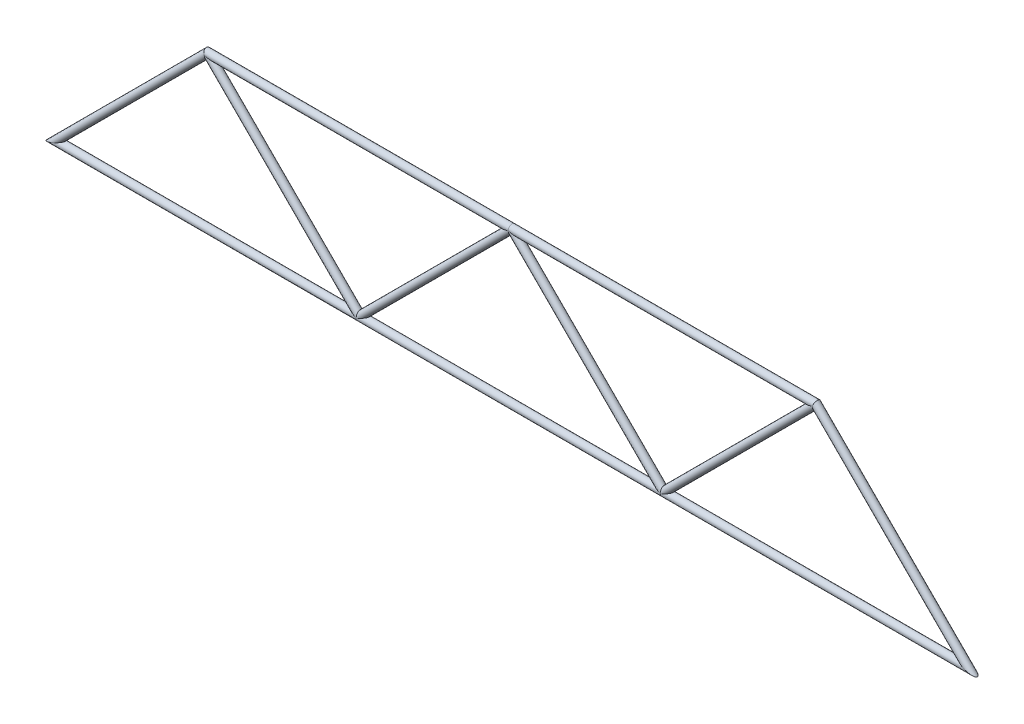
ISO-10303-21;
HEADER;
FILE_DESCRIPTION(('STEP AP214'),'2;1');
FILE_NAME('part.step','',(''),(''),'','','');
FILE_SCHEMA(('AUTOMOTIVE_DESIGN { 1 0 10303 214 1 1 1 1 }'));
ENDSEC;
DATA;
#1=APPLICATION_CONTEXT('core data for automotive mechanical design processes');
#2=APPLICATION_PROTOCOL_DEFINITION('international standard','automotive_design',2000,#1);
#3=PRODUCT_CONTEXT('',#1,'mechanical');
#4=PRODUCT('Part','Part','',(#3));
#5=PRODUCT_RELATED_PRODUCT_CATEGORY('part','',(#4));
#6=PRODUCT_DEFINITION_FORMATION('','',#4);
#7=PRODUCT_DEFINITION_CONTEXT('part definition',#1,'design');
#8=PRODUCT_DEFINITION('design','',#6,#7);
#9=PRODUCT_DEFINITION_SHAPE('','',#8);
#10=(LENGTH_UNIT() NAMED_UNIT(*) SI_UNIT(.MILLI.,.METRE.));
#11=(NAMED_UNIT(*) PLANE_ANGLE_UNIT() SI_UNIT($,.RADIAN.));
#12=(NAMED_UNIT(*) SI_UNIT($,.STERADIAN.) SOLID_ANGLE_UNIT());
#13=UNCERTAINTY_MEASURE_WITH_UNIT(LENGTH_MEASURE(1.E-05),#10,'distance_accuracy_value','');
#14=(GEOMETRIC_REPRESENTATION_CONTEXT(3) GLOBAL_UNCERTAINTY_ASSIGNED_CONTEXT((#13)) GLOBAL_UNIT_ASSIGNED_CONTEXT((#10,
#11,#12)) REPRESENTATION_CONTEXT('',''));
#15=CARTESIAN_POINT('',(0.,0.,0.));
#16=DIRECTION('',(0.,0.,1.));
#17=DIRECTION('',(1.,0.,0.));
#18=AXIS2_PLACEMENT_3D('',#15,#16,#17);
#19=CARTESIAN_POINT('',(2000.00000000001,1.11022302462516E-13,0.));
#20=DIRECTION('',(1.,0.,0.));
#21=DIRECTION('',(0.,1.,0.));
#22=AXIS2_PLACEMENT_3D('',#19,#20,#21);
#23=PLANE('',#22);
#24=CARTESIAN_POINT('',(2000.00000000001,-2.22044604925031E-13,-1.80434040253631E-13));
#25=DIRECTION('',(1.,0.,0.));
#26=DIRECTION('',(0.,1.,0.));
#27=AXIS2_PLACEMENT_3D('',#24,#25,#26);
#28=ELLIPSE('',#27,35.3553390593272,25.);
#29=CARTESIAN_POINT('',(2000.00000000001,9.99200722162641E-13,-25.0000000000002));
#30=VERTEX_POINT('',#29);
#31=CARTESIAN_POINT('',(2000.00000000001,9.43689570931383E-13,24.9999999999998));
#32=VERTEX_POINT('',#31);
#33=EDGE_CURVE('E93',#30,#32,#28,.T.);
#34=ORIENTED_EDGE('',*,*,#33,.T.);
#35=CARTESIAN_POINT('',(2000.00000000001,3.33066907387547E-13,-2.31141561761891E-13));
#36=DIRECTION('',(1.,0.,0.));
#37=DIRECTION('',(0.,1.,0.));
#38=AXIS2_PLACEMENT_3D('',#35,#36,#37);
#39=CIRCLE('',#38,25.);
#40=EDGE_CURVE('E81',#32,#30,#39,.F.);
#41=ORIENTED_EDGE('',*,*,#40,.T.);
#42=EDGE_LOOP('',(#34,#41));
#43=FACE_BOUND('',#42,.T.);
#44=ADVANCED_FACE('F61',(#43),#23,.T.);
#45=CARTESIAN_POINT('',(3999.99999999999,5.55111512312578E-13,-2.31193654288148E-13));
#46=DIRECTION('',(-1.,0.,0.));
#47=DIRECTION('',(0.,-1.,0.));
#48=AXIS2_PLACEMENT_3D('',#45,#46,#47);
#49=CYLINDRICAL_SURFACE('',#48,25.);
#50=CARTESIAN_POINT('',(2000.00000000001,3.88578058618805E-13,-2.05797687470442E-13));
#51=DIRECTION('',(0.382683432365084,0.923879532511289,0.));
#52=DIRECTION('',(-0.923879532511289,0.382683432365084,0.));
#53=AXIS2_PLACEMENT_3D('',#50,#51,#52);
#54=ELLIPSE('',#53,65.3281482438197,25.);
#55=EDGE_CURVE('E90',#32,#30,#54,.F.);
#56=ORIENTED_EDGE('',*,*,#55,.T.);
#57=ORIENTED_EDGE('',*,*,#40,.F.);
#58=EDGE_LOOP('',(#56,#57));
#59=FACE_BOUND('',#58,.T.);
#60=ADVANCED_FACE('F63',(#59),#49,.F.);
#61=CARTESIAN_POINT('',(2000.00000000001,2.77555756156289E-13,-1.80441028275446E-13));
#62=DIRECTION('',(-0.707106781186556,0.707106781186539,0.));
#63=DIRECTION('',(-0.707106781186539,-0.707106781186556,0.));
#64=AXIS2_PLACEMENT_3D('',#61,#62,#63);
#65=CYLINDRICAL_SURFACE('',#64,25.);
#66=ORIENTED_EDGE('',*,*,#55,.F.);
#67=ORIENTED_EDGE('',*,*,#33,.F.);
#68=EDGE_LOOP('',(#66,#67));
#69=FACE_BOUND('',#68,.T.);
#70=CARTESIAN_POINT('',(1000.,999.999999999988,-2.4941580790798E-13));
#71=DIRECTION('',(0.382683432365084,0.923879532511289,0.));
#72=DIRECTION('',(-0.923879532511289,0.382683432365084,0.));
#73=AXIS2_PLACEMENT_3D('',#70,#71,#72);
#74=ELLIPSE('',#73,65.3281482438197,25.);
#75=CARTESIAN_POINT('',(1000.,999.999999999989,24.9999999999997));
#76=VERTEX_POINT('',#75);
#77=CARTESIAN_POINT('',(1000.,999.999999999989,-25.0000000000002));
#78=VERTEX_POINT('',#77);
#79=EDGE_CURVE('E13',#76,#78,#74,.T.);
#80=ORIENTED_EDGE('',*,*,#79,.F.);
#81=CARTESIAN_POINT('',(1000.,999.999999999989,-2.49416218189564E-13));
#82=DIRECTION('',(-1.,0.,0.));
#83=DIRECTION('',(0.,1.,0.));
#84=AXIS2_PLACEMENT_3D('',#81,#82,#83);
#85=ELLIPSE('',#84,35.355339059327,25.);
#86=EDGE_CURVE('E69',#78,#76,#85,.T.);
#87=ORIENTED_EDGE('',*,*,#86,.F.);
#88=EDGE_LOOP('',(#80,#87));
#89=FACE_BOUND('',#88,.T.);
#90=ADVANCED_FACE('F95',(#69,#89),#65,.T.);
#91=CARTESIAN_POINT('',(2.22044604925031E-13,-3.33066907387547E-13,-1.87446096628357E-13));
#92=DIRECTION('',(0.707106781186551,0.707106781186544,0.));
#93=DIRECTION('',(-0.707106781186544,0.707106781186551,0.));
#94=AXIS2_PLACEMENT_3D('',#91,#92,#93);
#95=CYLINDRICAL_SURFACE('',#94,25.);
#96=ORIENTED_EDGE('',*,*,#86,.T.);
#97=CARTESIAN_POINT('',(1000.,999.999999999988,-2.74764499699317E-13));
#98=DIRECTION('',(-0.923879532511288,-0.382683432365088,0.));
#99=DIRECTION('',(0.382683432365087,-0.923879532511288,0.));
#100=AXIS2_PLACEMENT_3D('',#97,#98,#99);
#101=ELLIPSE('',#100,27.0598050073098,25.);
#102=EDGE_CURVE('E75',#78,#76,#101,.T.);
#103=ORIENTED_EDGE('',*,*,#102,.F.);
#104=EDGE_LOOP('',(#96,#103));
#105=FACE_BOUND('',#104,.T.);
#106=ADVANCED_FACE('F87',(#105),#95,.F.);
#107=CARTESIAN_POINT('',(999.999999999999,999.999999999988,-2.74767927535775E-13));
#108=DIRECTION('',(1.,0.,0.));
#109=DIRECTION('',(0.,0.,-1.));
#110=AXIS2_PLACEMENT_3D('',#107,#108,#109);
#111=CYLINDRICAL_SURFACE('',#110,25.);
#112=ORIENTED_EDGE('',*,*,#79,.T.);
#113=ORIENTED_EDGE('',*,*,#102,.T.);
#114=EDGE_LOOP('',(#112,#113));
#115=FACE_BOUND('',#114,.T.);
#116=ADVANCED_FACE('F92',(#115),#111,.F.);
#117=CLOSED_SHELL('',(#44,#60,#90,#106,#116));
#118=MANIFOLD_SOLID_BREP('B2',#117);
#119=CARTESIAN_POINT('',(2.77555756156289E-13,1.11022302462516E-13,-1.87522390804976E-13));
#120=DIRECTION('',(0.707106781186551,0.707106781186544,0.));
#121=DIRECTION('',(-0.707106781186544,0.707106781186551,0.));
#122=AXIS2_PLACEMENT_3D('',#119,#120,#121);
#123=CYLINDRICAL_SURFACE('',#122,25.);
#124=CARTESIAN_POINT('',(2.77555756156289E-13,1.11022302462516E-13,-1.87413970587727E-13));
#125=DIRECTION('',(0.382683432365088,-0.923879532511288,0.));
#126=DIRECTION('',(0.923879532511288,0.382683432365087,0.));
#127=AXIS2_PLACEMENT_3D('',#124,#125,#126);
#128=ELLIPSE('',#127,65.3281482438192,25.);
#129=CARTESIAN_POINT('',(60.3553390593281,25.0000000000001,-1.8885179766881E-13));
#130=VERTEX_POINT('',#129);
#131=EDGE_CURVE('E194',#130,#130,#128,.T.);
#132=ORIENTED_EDGE('',*,*,#131,.F.);
#133=EDGE_LOOP('',(#132));
#134=FACE_BOUND('',#133,.T.);
#135=CARTESIAN_POINT('',(1000.,999.99999999999,-2.74704845087901E-13));
#136=DIRECTION('',(0.923879532511288,0.382683432365087,0.));
#137=DIRECTION('',(-0.382683432365087,0.923879532511288,0.));
#138=AXIS2_PLACEMENT_3D('',#135,#136,#137);
#139=ELLIPSE('',#138,27.0598050073098,25.);
#140=CARTESIAN_POINT('',(989.644660940673,1024.99999999999,-2.76887614561472E-13));
#141=VERTEX_POINT('',#140);
#142=EDGE_CURVE('E60',#141,#141,#139,.T.);
#143=ORIENTED_EDGE('',*,*,#142,.F.);
#144=EDGE_LOOP('',(#143));
#145=FACE_BOUND('',#144,.T.);
#146=ADVANCED_FACE('F187',(#134,#145),#123,.T.);
#147=CARTESIAN_POINT('',(-1.66533453693773E-13,-1.11022302462516E-13,0.));
#148=DIRECTION('',(0.382683432365088,-0.923879532511288,0.));
#149=DIRECTION('',(0.923879532511288,0.382683432365087,0.));
#150=AXIS2_PLACEMENT_3D('',#147,#148,#149);
#151=PLANE('',#150);
#152=ORIENTED_EDGE('',*,*,#131,.T.);
#153=EDGE_LOOP('',(#152));
#154=FACE_BOUND('',#153,.T.);
#155=ADVANCED_FACE('F200',(#154),#151,.T.);
#156=CARTESIAN_POINT('',(1000.,999.99999999999,0.));
#157=DIRECTION('',(0.923879532511288,0.382683432365087,0.));
#158=DIRECTION('',(-0.382683432365087,0.923879532511288,0.));
#159=AXIS2_PLACEMENT_3D('',#156,#157,#158);
#160=PLANE('',#159);
#161=ORIENTED_EDGE('',*,*,#142,.T.);
#162=EDGE_LOOP('',(#161));
#163=FACE_BOUND('',#162,.T.);
#164=ADVANCED_FACE('F189',(#163),#160,.T.);
#165=CLOSED_SHELL('',(#146,#155,#164));
#166=MANIFOLD_SOLID_BREP('B7',#165);
#167=CARTESIAN_POINT('',(999.999999999999,999.999999999988,-2.74766102775344E-13));
#168=DIRECTION('',(1.,0.,0.));
#169=DIRECTION('',(0.,0.,-1.));
#170=AXIS2_PLACEMENT_3D('',#167,#168,#169);
#171=CYLINDRICAL_SURFACE('',#170,25.);
#172=CARTESIAN_POINT('',(3000.,999.999999999988,-2.74772879038922E-13));
#173=DIRECTION('',(1.,0.,0.));
#174=DIRECTION('',(0.,1.,0.));
#175=AXIS2_PLACEMENT_3D('',#172,#173,#174);
#176=CIRCLE('',#175,25.);
#177=CARTESIAN_POINT('',(3000.,1024.99999999999,-2.78936215381266E-13));
#178=VERTEX_POINT('',#177);
#179=EDGE_CURVE('E270',#178,#178,#176,.T.);
#180=ORIENTED_EDGE('',*,*,#179,.F.);
#181=EDGE_LOOP('',(#180));
#182=FACE_BOUND('',#181,.T.);
#183=CARTESIAN_POINT('',(1000.,999.999999999988,-2.74752550248188E-13));
#184=DIRECTION('',(-0.923879532511288,-0.382683432365088,0.));
#185=DIRECTION('',(0.382683432365088,-0.923879532511288,0.));
#186=AXIS2_PLACEMENT_3D('',#183,#184,#185);
#187=ELLIPSE('',#186,27.0598050073098,25.);
#188=CARTESIAN_POINT('',(1010.35533905933,974.999999999988,-2.67241945607942E-13));
#189=VERTEX_POINT('',#188);
#190=EDGE_CURVE('E186',#189,#189,#187,.T.);
#191=ORIENTED_EDGE('',*,*,#190,.F.);
#192=EDGE_LOOP('',(#191));
#193=FACE_BOUND('',#192,.T.);
#194=ADVANCED_FACE('F263',(#182,#193),#171,.T.);
#195=CARTESIAN_POINT('',(3000.,999.999999999989,0.));
#196=DIRECTION('',(1.,0.,0.));
#197=DIRECTION('',(0.,1.,0.));
#198=AXIS2_PLACEMENT_3D('',#195,#196,#197);
#199=PLANE('',#198);
#200=ORIENTED_EDGE('',*,*,#179,.T.);
#201=EDGE_LOOP('',(#200));
#202=FACE_BOUND('',#201,.T.);
#203=ADVANCED_FACE('F276',(#202),#199,.T.);
#204=CARTESIAN_POINT('',(1000.,999.999999999989,0.));
#205=DIRECTION('',(-0.923879532511288,-0.382683432365088,0.));
#206=DIRECTION('',(0.382683432365087,-0.923879532511288,0.));
#207=AXIS2_PLACEMENT_3D('',#204,#205,#206);
#208=PLANE('',#207);
#209=ORIENTED_EDGE('',*,*,#190,.T.);
#210=EDGE_LOOP('',(#209));
#211=FACE_BOUND('',#210,.T.);
#212=ADVANCED_FACE('F265',(#211),#208,.T.);
#213=CLOSED_SHELL('',(#194,#203,#212));
#214=MANIFOLD_SOLID_BREP('B55',#213);
#215=CARTESIAN_POINT('',(2000.00000000001,1.01703584790003E-11,-1.01089040822171E-11));
#216=DIRECTION('',(-1.,0.,0.));
#217=DIRECTION('',(0.,-1.,0.));
#218=AXIS2_PLACEMENT_3D('',#215,#216,#217);
#219=CYLINDRICAL_SURFACE('',#218,25.);
#220=CARTESIAN_POINT('',(2000.00000000001,1.01702771638373E-11,-1.01089040822171E-11));
#221=DIRECTION('',(1.,0.,0.));
#222=DIRECTION('',(0.,1.,0.));
#223=AXIS2_PLACEMENT_3D('',#220,#221,#222);
#224=CIRCLE('',#223,25.);
#225=CARTESIAN_POINT('',(2000.00000000001,25.0000000000102,-1.01075163034363E-11));
#226=VERTEX_POINT('',#225);
#227=EDGE_CURVE('E349',#226,#226,#224,.T.);
#228=ORIENTED_EDGE('',*,*,#227,.F.);
#229=EDGE_LOOP('',(#228));
#230=FACE_BOUND('',#229,.T.);
#231=CARTESIAN_POINT('',(5.55111512312578E-13,-9.65086300805384E-12,9.68572734655679E-12));
#232=DIRECTION('',(-0.382683432365096,0.923879532511284,0.));
#233=DIRECTION('',(-0.923879532511284,-0.382683432365097,0.));
#234=AXIS2_PLACEMENT_3D('',#231,#232,#233);
#235=ELLIPSE('',#234,65.3281482438192,25.);
#236=CARTESIAN_POINT('',(-60.355339059327,-25.0000000000102,1.02822768444738E-11));
#237=VERTEX_POINT('',#236);
#238=EDGE_CURVE('E262',#237,#237,#235,.T.);
#239=ORIENTED_EDGE('',*,*,#238,.F.);
#240=EDGE_LOOP('',(#239));
#241=FACE_BOUND('',#240,.T.);
#242=ADVANCED_FACE('F341',(#230,#241),#219,.T.);
#243=CARTESIAN_POINT('',(2000.00000000001,9.94823255891231E-12,-9.92147263164869E-12));
#244=DIRECTION('',(1.,0.,0.));
#245=DIRECTION('',(0.,1.,0.));
#246=AXIS2_PLACEMENT_3D('',#243,#244,#245);
#247=PLANE('',#246);
#248=ORIENTED_EDGE('',*,*,#227,.T.);
#249=EDGE_LOOP('',(#248));
#250=FACE_BOUND('',#249,.T.);
#251=ADVANCED_FACE('F356',(#250),#247,.T.);
#252=CARTESIAN_POINT('',(1.11022302462516E-13,-9.8729618230875E-12,9.87324011228816E-12));
#253=DIRECTION('',(-0.382683432365096,0.923879532511284,0.));
#254=DIRECTION('',(-0.923879532511284,-0.382683432365097,0.));
#255=AXIS2_PLACEMENT_3D('',#252,#253,#254);
#256=PLANE('',#255);
#257=ORIENTED_EDGE('',*,*,#238,.T.);
#258=EDGE_LOOP('',(#257));
#259=FACE_BOUND('',#258,.T.);
#260=ADVANCED_FACE('F343',(#259),#256,.T.);
#261=CLOSED_SHELL('',(#242,#251,#260));
#262=MANIFOLD_SOLID_BREP('B181',#261);
#263=CARTESIAN_POINT('',(3000.,999.999999999989,-3.11326688448077E-13));
#264=DIRECTION('',(-0.707106781186546,-0.707106781186548,0.));
#265=DIRECTION('',(0.707106781186549,-0.707106781186547,0.));
#266=AXIS2_PLACEMENT_3D('',#263,#264,#265);
#267=CYLINDRICAL_SURFACE('',#266,25.);
#268=CARTESIAN_POINT('',(3000.,999.999999999988,-2.93043376402475E-13));
#269=DIRECTION('',(0.382683432365091,-0.923879532511286,0.));
#270=DIRECTION('',(-0.923879532511287,-0.38268343236509,0.));
#271=AXIS2_PLACEMENT_3D('',#268,#269,#270);
#272=ELLIPSE('',#271,65.3281482438186,25.);
#273=CARTESIAN_POINT('',(3000.,999.999999999988,-25.0000000000003));
#274=VERTEX_POINT('',#273);
#275=CARTESIAN_POINT('',(3000.,999.999999999988,24.9999999999997));
#276=VERTEX_POINT('',#275);
#277=EDGE_CURVE('E429',#274,#276,#272,.F.);
#278=ORIENTED_EDGE('',*,*,#277,.F.);
#279=CARTESIAN_POINT('',(3000.,999.999999999989,-3.11326688448077E-13));
#280=DIRECTION('',(1.,0.,0.));
#281=DIRECTION('',(0.,-1.,0.));
#282=AXIS2_PLACEMENT_3D('',#279,#280,#281);
#283=ELLIPSE('',#282,35.3553390593272,25.);
#284=EDGE_CURVE('E451',#276,#274,#283,.T.);
#285=ORIENTED_EDGE('',*,*,#284,.F.);
#286=EDGE_LOOP('',(#278,#285));
#287=FACE_BOUND('',#286,.T.);
#288=CARTESIAN_POINT('',(2000.00000000001,1.11022302462516E-13,-2.4942369424794E-13));
#289=DIRECTION('',(0.382683432365091,-0.923879532511287,0.));
#290=DIRECTION('',(-0.923879532511287,-0.38268343236509,0.));
#291=AXIS2_PLACEMENT_3D('',#288,#289,#290);
#292=ELLIPSE('',#291,65.3281482438186,25.);
#293=CARTESIAN_POINT('',(2000.00000000001,1.11022302462516E-12,-25.0000000000002));
#294=VERTEX_POINT('',#293);
#295=CARTESIAN_POINT('',(2000.00000000001,1.22124532708767E-12,24.9999999999997));
#296=VERTEX_POINT('',#295);
#297=EDGE_CURVE('E339',#294,#296,#292,.T.);
#298=ORIENTED_EDGE('',*,*,#297,.F.);
#299=CARTESIAN_POINT('',(2000.00000000001,-3.33066907387547E-13,-2.67697219092535E-13));
#300=DIRECTION('',(-1.,0.,0.));
#301=DIRECTION('',(0.,-1.,0.));
#302=AXIS2_PLACEMENT_3D('',#299,#300,#301);
#303=ELLIPSE('',#302,35.3553390593272,25.);
#304=EDGE_CURVE('E423',#296,#294,#303,.T.);
#305=ORIENTED_EDGE('',*,*,#304,.F.);
#306=EDGE_LOOP('',(#298,#305));
#307=FACE_BOUND('',#306,.T.);
#308=ADVANCED_FACE('F419',(#287,#307),#267,.T.);
#309=CARTESIAN_POINT('',(2000.00000000001,2.22044604925031E-13,0.));
#310=DIRECTION('',(-1.,0.,0.));
#311=DIRECTION('',(0.,-1.,0.));
#312=AXIS2_PLACEMENT_3D('',#309,#310,#311);
#313=PLANE('',#312);
#314=ORIENTED_EDGE('',*,*,#304,.T.);
#315=CARTESIAN_POINT('',(2000.00000000001,4.44089209850063E-13,-2.31142612281269E-13));
#316=DIRECTION('',(-1.,0.,0.));
#317=DIRECTION('',(0.,-1.,0.));
#318=AXIS2_PLACEMENT_3D('',#315,#316,#317);
#319=CIRCLE('',#318,25.);
#320=EDGE_CURVE('E436',#294,#296,#319,.F.);
#321=ORIENTED_EDGE('',*,*,#320,.T.);
#322=EDGE_LOOP('',(#314,#321));
#323=FACE_BOUND('',#322,.T.);
#324=ADVANCED_FACE('F460',(#323),#313,.T.);
#325=CARTESIAN_POINT('',(3000.,999.999999999989,0.));
#326=DIRECTION('',(1.,0.,0.));
#327=DIRECTION('',(0.,1.,0.));
#328=AXIS2_PLACEMENT_3D('',#325,#326,#327);
#329=PLANE('',#328);
#330=ORIENTED_EDGE('',*,*,#284,.T.);
#331=CARTESIAN_POINT('',(3000.,999.999999999988,-2.74765358312793E-13));
#332=DIRECTION('',(1.,0.,0.));
#333=DIRECTION('',(0.,1.,0.));
#334=AXIS2_PLACEMENT_3D('',#331,#332,#333);
#335=CIRCLE('',#334,25.);
#336=EDGE_CURVE('E444',#274,#276,#335,.F.);
#337=ORIENTED_EDGE('',*,*,#336,.T.);
#338=EDGE_LOOP('',(#330,#337));
#339=FACE_BOUND('',#338,.T.);
#340=ADVANCED_FACE('F455',(#339),#329,.T.);
#341=CARTESIAN_POINT('',(999.999999999999,999.999999999988,-2.74681554990574E-13));
#342=DIRECTION('',(1.,0.,0.));
#343=DIRECTION('',(0.,0.,-1.));
#344=AXIS2_PLACEMENT_3D('',#341,#342,#343);
#345=CYLINDRICAL_SURFACE('',#344,25.);
#346=ORIENTED_EDGE('',*,*,#277,.T.);
#347=ORIENTED_EDGE('',*,*,#336,.F.);
#348=EDGE_LOOP('',(#346,#347));
#349=FACE_BOUND('',#348,.T.);
#350=ADVANCED_FACE('F448',(#349),#345,.F.);
#351=CARTESIAN_POINT('',(3999.99999999999,0.,-2.31205047873905E-13));
#352=DIRECTION('',(-1.,0.,0.));
#353=DIRECTION('',(0.,-1.,0.));
#354=AXIS2_PLACEMENT_3D('',#351,#352,#353);
#355=CYLINDRICAL_SURFACE('',#354,25.);
#356=ORIENTED_EDGE('',*,*,#297,.T.);
#357=ORIENTED_EDGE('',*,*,#320,.F.);
#358=EDGE_LOOP('',(#356,#357));
#359=FACE_BOUND('',#358,.T.);
#360=ADVANCED_FACE('F421',(#359),#355,.F.);
#361=CLOSED_SHELL('',(#308,#324,#340,#350,#360));
#362=MANIFOLD_SOLID_BREP('B257',#361);
#363=CARTESIAN_POINT('',(3999.99999999999,1.56619780079109E-13,-2.31135445477199E-13));
#364=DIRECTION('',(-1.,0.,0.));
#365=DIRECTION('',(0.,-1.,0.));
#366=AXIS2_PLACEMENT_3D('',#363,#364,#365);
#367=CYLINDRICAL_SURFACE('',#366,25.);
#368=CARTESIAN_POINT('',(3999.99999999999,1.56619780079109E-13,-2.31135445477199E-13));
#369=DIRECTION('',(1.,0.,0.));
#370=DIRECTION('',(0.,1.,0.));
#371=AXIS2_PLACEMENT_3D('',#368,#369,#370);
#372=CIRCLE('',#371,25.);
#373=CARTESIAN_POINT('',(3999.99999999999,25.0000000000001,-2.31135445477199E-13));
#374=VERTEX_POINT('',#373);
#375=EDGE_CURVE('E554',#374,#374,#372,.T.);
#376=ORIENTED_EDGE('',*,*,#375,.F.);
#377=EDGE_LOOP('',(#376));
#378=FACE_BOUND('',#377,.T.);
#379=CARTESIAN_POINT('',(2000.00000000001,2.92734586571086E-13,-2.31135445477199E-13));
#380=DIRECTION('',(-1.,0.,0.));
#381=DIRECTION('',(0.,-1.,0.));
#382=AXIS2_PLACEMENT_3D('',#379,#380,#381);
#383=CIRCLE('',#382,25.);
#384=CARTESIAN_POINT('',(2000.00000000001,-24.9999999999997,-2.31135445477199E-13));
#385=VERTEX_POINT('',#384);
#386=EDGE_CURVE('E418',#385,#385,#383,.T.);
#387=ORIENTED_EDGE('',*,*,#386,.F.);
#388=EDGE_LOOP('',(#387));
#389=FACE_BOUND('',#388,.T.);
#390=ADVANCED_FACE('F547',(#378,#389),#367,.T.);
#391=CARTESIAN_POINT('',(3999.99999999999,0.,0.));
#392=DIRECTION('',(1.,0.,0.));
#393=DIRECTION('',(0.,1.,0.));
#394=AXIS2_PLACEMENT_3D('',#391,#392,#393);
#395=PLANE('',#394);
#396=ORIENTED_EDGE('',*,*,#375,.T.);
#397=EDGE_LOOP('',(#396));
#398=FACE_BOUND('',#397,.T.);
#399=ADVANCED_FACE('F560',(#398),#395,.T.);
#400=CARTESIAN_POINT('',(2000.00000000001,0.,0.));
#401=DIRECTION('',(-1.,0.,0.));
#402=DIRECTION('',(0.,-1.,0.));
#403=AXIS2_PLACEMENT_3D('',#400,#401,#402);
#404=PLANE('',#403);
#405=ORIENTED_EDGE('',*,*,#386,.T.);
#406=EDGE_LOOP('',(#405));
#407=FACE_BOUND('',#406,.T.);
#408=ADVANCED_FACE('F549',(#407),#404,.T.);
#409=CLOSED_SHELL('',(#390,#399,#408));
#410=MANIFOLD_SOLID_BREP('B333',#409);
#411=CARTESIAN_POINT('',(3999.99999999998,1.0769163338864E-11,-1.80438991756778E-13));
#412=DIRECTION('',(-0.707106781186549,0.707106781186546,0.));
#413=DIRECTION('',(-0.707106781186546,-0.707106781186549,0.));
#414=AXIS2_PLACEMENT_3D('',#411,#412,#413);
#415=CYLINDRICAL_SURFACE('',#414,25.);
#416=CARTESIAN_POINT('',(3000.,999.999999999988,-2.49412289081655E-13));
#417=DIRECTION('',(0.382683432365089,0.923879532511287,0.));
#418=DIRECTION('',(-0.923879532511287,0.382683432365089,0.));
#419=AXIS2_PLACEMENT_3D('',#416,#417,#418);
#420=ELLIPSE('',#419,65.3281482438189,25.);
#421=CARTESIAN_POINT('',(3000.,999.999999999987,24.9999999999997));
#422=VERTEX_POINT('',#421);
#423=CARTESIAN_POINT('',(3000.,999.999999999987,-25.0000000000002));
#424=VERTEX_POINT('',#423);
#425=EDGE_CURVE('E655',#422,#424,#420,.T.);
#426=ORIENTED_EDGE('',*,*,#425,.F.);
#427=CARTESIAN_POINT('',(3000.,999.999999999989,-2.24064444323265E-13));
#428=DIRECTION('',(-1.,0.,0.));
#429=DIRECTION('',(0.,1.,0.));
#430=AXIS2_PLACEMENT_3D('',#427,#428,#429);
#431=ELLIPSE('',#430,35.3553390593275,25.);
#432=EDGE_CURVE('E665',#424,#422,#431,.T.);
#433=ORIENTED_EDGE('',*,*,#432,.F.);
#434=EDGE_LOOP('',(#426,#433));
#435=FACE_BOUND('',#434,.T.);
#436=CARTESIAN_POINT('',(3999.99999999999,3.33066907387547E-13,-2.05786386528914E-13));
#437=DIRECTION('',(0.382683432365089,0.923879532511287,0.));
#438=DIRECTION('',(-0.923879532511287,0.382683432365089,0.));
#439=AXIS2_PLACEMENT_3D('',#436,#437,#438);
#440=ELLIPSE('',#439,65.3281482438189,25.);
#441=CARTESIAN_POINT('',(3999.99999999999,7.7715611723761E-13,24.9999999999998));
#442=VERTEX_POINT('',#441);
#443=CARTESIAN_POINT('',(3999.99999999999,7.7715611723761E-13,-25.0000000000002));
#444=VERTEX_POINT('',#443);
#445=EDGE_CURVE('E545',#442,#444,#440,.F.);
#446=ORIENTED_EDGE('',*,*,#445,.F.);
#447=CARTESIAN_POINT('',(3999.99999999999,-3.33066907387547E-13,-1.80439560857039E-13));
#448=DIRECTION('',(1.,0.,0.));
#449=DIRECTION('',(0.,1.,0.));
#450=AXIS2_PLACEMENT_3D('',#447,#448,#449);
#451=ELLIPSE('',#450,35.3553390593275,25.);
#452=EDGE_CURVE('E635',#444,#442,#451,.T.);
#453=ORIENTED_EDGE('',*,*,#452,.F.);
#454=EDGE_LOOP('',(#446,#453));
#455=FACE_BOUND('',#454,.T.);
#456=ADVANCED_FACE('F631',(#435,#455),#415,.T.);
#457=CARTESIAN_POINT('',(3000.,999.999999999989,0.));
#458=DIRECTION('',(-1.,0.,0.));
#459=DIRECTION('',(0.,-1.,0.));
#460=AXIS2_PLACEMENT_3D('',#457,#458,#459);
#461=PLANE('',#460);
#462=ORIENTED_EDGE('',*,*,#432,.T.);
#463=CARTESIAN_POINT('',(3000.,999.999999999988,-2.74765202802837E-13));
#464=DIRECTION('',(-1.,0.,0.));
#465=DIRECTION('',(0.,-1.,0.));
#466=AXIS2_PLACEMENT_3D('',#463,#464,#465);
#467=CIRCLE('',#466,25.);
#468=EDGE_CURVE('E658',#422,#424,#467,.F.);
#469=ORIENTED_EDGE('',*,*,#468,.T.);
#470=EDGE_LOOP('',(#462,#469));
#471=FACE_BOUND('',#470,.T.);
#472=ADVANCED_FACE('F664',(#471),#461,.T.);
#473=CARTESIAN_POINT('',(999.999999999999,999.999999999988,-2.74740546203138E-13));
#474=DIRECTION('',(1.,0.,0.));
#475=DIRECTION('',(0.,0.,-1.));
#476=AXIS2_PLACEMENT_3D('',#473,#474,#475);
#477=CYLINDRICAL_SURFACE('',#476,25.);
#478=ORIENTED_EDGE('',*,*,#425,.T.);
#479=ORIENTED_EDGE('',*,*,#468,.F.);
#480=EDGE_LOOP('',(#478,#479));
#481=FACE_BOUND('',#480,.T.);
#482=ADVANCED_FACE('F657',(#481),#477,.F.);
#483=CARTESIAN_POINT('',(3999.99999999999,0.,0.));
#484=DIRECTION('',(1.,0.,0.));
#485=DIRECTION('',(0.,1.,0.));
#486=AXIS2_PLACEMENT_3D('',#483,#484,#485);
#487=PLANE('',#486);
#488=ORIENTED_EDGE('',*,*,#452,.T.);
#489=CARTESIAN_POINT('',(3999.99999999999,2.22044604925031E-13,-2.31132854858764E-13));
#490=DIRECTION('',(1.,0.,0.));
#491=DIRECTION('',(0.,1.,0.));
#492=AXIS2_PLACEMENT_3D('',#489,#490,#491);
#493=CIRCLE('',#492,25.);
#494=EDGE_CURVE('E640',#442,#444,#493,.F.);
#495=ORIENTED_EDGE('',*,*,#494,.T.);
#496=EDGE_LOOP('',(#488,#495));
#497=FACE_BOUND('',#496,.T.);
#498=ADVANCED_FACE('F672',(#497),#487,.T.);
#499=CARTESIAN_POINT('',(6000.,4.44089209850063E-13,-1.8751648142668E-13));
#500=DIRECTION('',(-1.,0.,0.));
#501=DIRECTION('',(0.,-1.,0.));
#502=AXIS2_PLACEMENT_3D('',#499,#500,#501);
#503=CYLINDRICAL_SURFACE('',#502,25.);
#504=ORIENTED_EDGE('',*,*,#445,.T.);
#505=ORIENTED_EDGE('',*,*,#494,.F.);
#506=EDGE_LOOP('',(#504,#505));
#507=FACE_BOUND('',#506,.T.);
#508=ADVANCED_FACE('F633',(#507),#503,.F.);
#509=CLOSED_SHELL('',(#456,#472,#482,#498,#508));
#510=MANIFOLD_SOLID_BREP('B413',#509);
#511=CARTESIAN_POINT('',(4999.99999999999,999.999999999978,-3.11342135218836E-13));
#512=DIRECTION('',(-0.707106781186554,-0.707106781186541,0.));
#513=DIRECTION('',(0.707106781186541,-0.707106781186554,0.));
#514=AXIS2_PLACEMENT_3D('',#511,#512,#513);
#515=CYLINDRICAL_SURFACE('',#514,25.);
#516=CARTESIAN_POINT('',(5000.,999.999999999988,-2.93057684972711E-13));
#517=DIRECTION('',(0.382683432365086,-0.923879532511289,0.));
#518=DIRECTION('',(-0.923879532511289,-0.382683432365086,0.));
#519=AXIS2_PLACEMENT_3D('',#516,#517,#518);
#520=ELLIPSE('',#519,65.3281482438195,25.);
#521=CARTESIAN_POINT('',(5000.,999.999999999988,-25.0000000000003));
#522=VERTEX_POINT('',#521);
#523=CARTESIAN_POINT('',(5000.,999.999999999988,24.9999999999997));
#524=VERTEX_POINT('',#523);
#525=EDGE_CURVE('E788',#522,#524,#520,.F.);
#526=ORIENTED_EDGE('',*,*,#525,.F.);
#527=CARTESIAN_POINT('',(5000.,999.999999999988,-2.93057684972711E-13));
#528=DIRECTION('',(-1.,0.,0.));
#529=DIRECTION('',(0.,-1.,0.));
#530=AXIS2_PLACEMENT_3D('',#527,#528,#529);
#531=ELLIPSE('',#530,35.3553390593271,25.);
#532=EDGE_CURVE('E782',#524,#522,#531,.F.);
#533=ORIENTED_EDGE('',*,*,#532,.F.);
#534=EDGE_LOOP('',(#526,#533));
#535=FACE_BOUND('',#534,.T.);
#536=CARTESIAN_POINT('',(3999.99999999999,1.11022302462516E-13,-2.49408237551014E-13));
#537=DIRECTION('',(0.382683432365086,-0.923879532511289,0.));
#538=DIRECTION('',(-0.923879532511289,-0.382683432365086,0.));
#539=AXIS2_PLACEMENT_3D('',#536,#537,#538);
#540=ELLIPSE('',#539,65.3281482438195,25.);
#541=CARTESIAN_POINT('',(3999.99999999999,1.38777878078145E-12,-25.0000000000002));
#542=VERTEX_POINT('',#541);
#543=CARTESIAN_POINT('',(3999.99999999999,1.38777878078145E-12,24.9999999999997));
#544=VERTEX_POINT('',#543);
#545=EDGE_CURVE('E629',#542,#544,#540,.T.);
#546=ORIENTED_EDGE('',*,*,#545,.F.);
#547=CARTESIAN_POINT('',(3999.99999999999,-1.22124532708767E-12,-2.67682642515781E-13));
#548=DIRECTION('',(-1.,0.,0.));
#549=DIRECTION('',(0.,-1.,0.));
#550=AXIS2_PLACEMENT_3D('',#547,#548,#549);
#551=ELLIPSE('',#550,35.3553390593268,25.);
#552=EDGE_CURVE('E761',#544,#542,#551,.T.);
#553=ORIENTED_EDGE('',*,*,#552,.F.);
#554=EDGE_LOOP('',(#546,#553));
#555=FACE_BOUND('',#554,.T.);
#556=ADVANCED_FACE('F757',(#535,#555),#515,.T.);
#557=CARTESIAN_POINT('',(3999.99999999999,-1.11022302462516E-13,0.));
#558=DIRECTION('',(-1.,0.,0.));
#559=DIRECTION('',(0.,-1.,0.));
#560=AXIS2_PLACEMENT_3D('',#557,#558,#559);
#561=PLANE('',#560);
#562=ORIENTED_EDGE('',*,*,#552,.T.);
#563=CARTESIAN_POINT('',(3999.99999999999,1.66533453693773E-13,-2.31126143115273E-13));
#564=DIRECTION('',(-1.,0.,0.));
#565=DIRECTION('',(0.,-1.,0.));
#566=AXIS2_PLACEMENT_3D('',#563,#564,#565);
#567=CIRCLE('',#566,25.);
#568=EDGE_CURVE('E774',#542,#544,#567,.F.);
#569=ORIENTED_EDGE('',*,*,#568,.T.);
#570=EDGE_LOOP('',(#562,#569));
#571=FACE_BOUND('',#570,.T.);
#572=ADVANCED_FACE('F798',(#571),#561,.T.);
#573=CARTESIAN_POINT('',(5000.,999.999999999989,-2.74783862343095E-13));
#574=DIRECTION('',(0.707106781186551,-0.707106781186544,0.));
#575=DIRECTION('',(0.707106781186544,0.707106781186551,0.));
#576=AXIS2_PLACEMENT_3D('',#573,#574,#575);
#577=CYLINDRICAL_SURFACE('',#576,25.);
#578=ORIENTED_EDGE('',*,*,#532,.T.);
#579=CARTESIAN_POINT('',(5000.,999.999999999988,-2.74776622858374E-13));
#580=DIRECTION('',(0.923879532511288,-0.382683432365087,0.));
#581=DIRECTION('',(0.382683432365087,0.923879532511288,0.));
#582=AXIS2_PLACEMENT_3D('',#579,#580,#581);
#583=ELLIPSE('',#582,27.0598050073098,25.);
#584=EDGE_CURVE('E767',#524,#522,#583,.T.);
#585=ORIENTED_EDGE('',*,*,#584,.F.);
#586=EDGE_LOOP('',(#578,#585));
#587=FACE_BOUND('',#586,.T.);
#588=ADVANCED_FACE('F785',(#587),#577,.F.);
#589=CARTESIAN_POINT('',(3000.,999.999999999988,-2.74800101552881E-13));
#590=DIRECTION('',(1.,0.,0.));
#591=DIRECTION('',(0.,0.,-1.));
#592=AXIS2_PLACEMENT_3D('',#589,#590,#591);
#593=CYLINDRICAL_SURFACE('',#592,25.);
#594=ORIENTED_EDGE('',*,*,#525,.T.);
#595=ORIENTED_EDGE('',*,*,#584,.T.);
#596=EDGE_LOOP('',(#594,#595));
#597=FACE_BOUND('',#596,.T.);
#598=ADVANCED_FACE('F790',(#597),#593,.F.);
#599=CARTESIAN_POINT('',(6000.,1.66533453693773E-13,-1.87440511504861E-13));
#600=DIRECTION('',(-1.,0.,0.));
#601=DIRECTION('',(0.,-1.,0.));
#602=AXIS2_PLACEMENT_3D('',#599,#600,#601);
#603=CYLINDRICAL_SURFACE('',#602,25.);
#604=ORIENTED_EDGE('',*,*,#545,.T.);
#605=ORIENTED_EDGE('',*,*,#568,.F.);
#606=EDGE_LOOP('',(#604,#605));
#607=FACE_BOUND('',#606,.T.);
#608=ADVANCED_FACE('F759',(#607),#603,.F.);
#609=CLOSED_SHELL('',(#556,#572,#588,#598,#608));
#610=MANIFOLD_SOLID_BREP('B539',#609);
#611=CARTESIAN_POINT('',(6000.,2.21990394816407E-13,-1.87375780486026E-13));
#612=DIRECTION('',(-1.,0.,0.));
#613=DIRECTION('',(0.,-1.,0.));
#614=AXIS2_PLACEMENT_3D('',#611,#612,#613);
#615=CYLINDRICAL_SURFACE('',#614,25.);
#616=CARTESIAN_POINT('',(6000.,2.21990394816407E-13,-1.87375780486026E-13));
#617=DIRECTION('',(0.382683432365087,0.923879532511288,0.));
#618=DIRECTION('',(-0.923879532511288,0.382683432365087,0.));
#619=AXIS2_PLACEMENT_3D('',#616,#617,#618);
#620=ELLIPSE('',#619,65.3281482438192,25.);
#621=CARTESIAN_POINT('',(5939.64466094067,25.0000000000002,-1.92815441561257E-13));
#622=VERTEX_POINT('',#621);
#623=EDGE_CURVE('E888',#622,#622,#620,.T.);
#624=ORIENTED_EDGE('',*,*,#623,.F.);
#625=EDGE_LOOP('',(#624));
#626=FACE_BOUND('',#625,.T.);
#627=CARTESIAN_POINT('',(3999.99999999999,1.56748529087092E-13,-2.31069128037192E-13));
#628=DIRECTION('',(-1.,0.,0.));
#629=DIRECTION('',(0.,-1.,0.));
#630=AXIS2_PLACEMENT_3D('',#627,#628,#629);
#631=CIRCLE('',#630,25.);
#632=CARTESIAN_POINT('',(3999.99999999999,-24.9999999999998,-2.31069128037192E-13));
#633=VERTEX_POINT('',#632);
#634=EDGE_CURVE('E756',#633,#633,#631,.T.);
#635=ORIENTED_EDGE('',*,*,#634,.F.);
#636=EDGE_LOOP('',(#635));
#637=FACE_BOUND('',#636,.T.);
#638=ADVANCED_FACE('F881',(#626,#637),#615,.T.);
#639=CARTESIAN_POINT('',(6000.,0.,0.));
#640=DIRECTION('',(0.382683432365087,0.923879532511288,0.));
#641=DIRECTION('',(-0.923879532511288,0.382683432365087,0.));
#642=AXIS2_PLACEMENT_3D('',#639,#640,#641);
#643=PLANE('',#642);
#644=ORIENTED_EDGE('',*,*,#623,.T.);
#645=EDGE_LOOP('',(#644));
#646=FACE_BOUND('',#645,.T.);
#647=ADVANCED_FACE('F894',(#646),#643,.T.);
#648=CARTESIAN_POINT('',(3999.99999999999,0.,0.));
#649=DIRECTION('',(-1.,0.,0.));
#650=DIRECTION('',(0.,-1.,0.));
#651=AXIS2_PLACEMENT_3D('',#648,#649,#650);
#652=PLANE('',#651);
#653=ORIENTED_EDGE('',*,*,#634,.T.);
#654=EDGE_LOOP('',(#653));
#655=FACE_BOUND('',#654,.T.);
#656=ADVANCED_FACE('F883',(#655),#652,.T.);
#657=CLOSED_SHELL('',(#638,#647,#656));
#658=MANIFOLD_SOLID_BREP('B623',#657);
#659=CARTESIAN_POINT('',(5000.,999.999999999989,-2.74967729704015E-13));
#660=DIRECTION('',(0.707106781186551,-0.707106781186544,0.));
#661=DIRECTION('',(0.707106781186544,0.707106781186551,0.));
#662=AXIS2_PLACEMENT_3D('',#659,#660,#661);
#663=CYLINDRICAL_SURFACE('',#662,25.);
#664=CARTESIAN_POINT('',(5000.,999.999999999988,-2.74874132563343E-13));
#665=DIRECTION('',(-0.923879532511288,0.382683432365087,0.));
#666=DIRECTION('',(-0.382683432365087,-0.923879532511288,0.));
#667=AXIS2_PLACEMENT_3D('',#664,#665,#666);
#668=ELLIPSE('',#667,27.0598050073098,25.);
#669=CARTESIAN_POINT('',(4989.64466094067,974.999999999988,-2.74240425296823E-13));
#670=VERTEX_POINT('',#669);
#671=EDGE_CURVE('E963',#670,#670,#668,.T.);
#672=ORIENTED_EDGE('',*,*,#671,.F.);
#673=EDGE_LOOP('',(#672));
#674=FACE_BOUND('',#673,.T.);
#675=CARTESIAN_POINT('',(6000.,8.88178419700125E-13,-1.8717318823758E-13));
#676=DIRECTION('',(-0.382683432365087,-0.923879532511288,0.));
#677=DIRECTION('',(0.923879532511288,-0.382683432365087,0.));
#678=AXIS2_PLACEMENT_3D('',#675,#676,#677);
#679=ELLIPSE('',#678,65.3281482438192,25.);
#680=CARTESIAN_POINT('',(6060.35533905933,-24.9999999999991,-1.85770775616622E-13));
#681=VERTEX_POINT('',#680);
#682=EDGE_CURVE('E880',#681,#681,#679,.T.);
#683=ORIENTED_EDGE('',*,*,#682,.F.);
#684=EDGE_LOOP('',(#683));
#685=FACE_BOUND('',#684,.T.);
#686=ADVANCED_FACE('F956',(#674,#685),#663,.T.);
#687=CARTESIAN_POINT('',(5000.,999.99999999999,0.));
#688=DIRECTION('',(-0.923879532511288,0.382683432365087,0.));
#689=DIRECTION('',(-0.382683432365087,-0.923879532511288,0.));
#690=AXIS2_PLACEMENT_3D('',#687,#688,#689);
#691=PLANE('',#690);
#692=ORIENTED_EDGE('',*,*,#671,.T.);
#693=EDGE_LOOP('',(#692));
#694=FACE_BOUND('',#693,.T.);
#695=ADVANCED_FACE('F969',(#694),#691,.T.);
#696=CARTESIAN_POINT('',(6000.,-1.11022302462516E-13,0.));
#697=DIRECTION('',(-0.382683432365087,-0.923879532511288,0.));
#698=DIRECTION('',(0.923879532511288,-0.382683432365087,0.));
#699=AXIS2_PLACEMENT_3D('',#696,#697,#698);
#700=PLANE('',#699);
#701=ORIENTED_EDGE('',*,*,#682,.T.);
#702=EDGE_LOOP('',(#701));
#703=FACE_BOUND('',#702,.T.);
#704=ADVANCED_FACE('F958',(#703),#700,.T.);
#705=CLOSED_SHELL('',(#686,#695,#704));
#706=MANIFOLD_SOLID_BREP('B751',#705);
#707=CARTESIAN_POINT('',(3000.,999.999999999978,9.60065436909918E-12));
#708=DIRECTION('',(1.,0.,0.));
#709=DIRECTION('',(0.,0.,-1.));
#710=AXIS2_PLACEMENT_3D('',#707,#708,#709);
#711=CYLINDRICAL_SURFACE('',#710,25.);
#712=CARTESIAN_POINT('',(3000.,999.999999999978,9.6006475928356E-12));
#713=DIRECTION('',(-1.,0.,0.));
#714=DIRECTION('',(0.,-1.,0.));
#715=AXIS2_PLACEMENT_3D('',#712,#713,#714);
#716=CIRCLE('',#715,25.);
#717=CARTESIAN_POINT('',(3000.,974.999999999978,9.59787203527404E-12));
#718=VERTEX_POINT('',#717);
#719=EDGE_CURVE('E1031',#718,#718,#716,.T.);
#720=ORIENTED_EDGE('',*,*,#719,.F.);
#721=EDGE_LOOP('',(#720));
#722=FACE_BOUND('',#721,.T.);
#723=CARTESIAN_POINT('',(5000.,999.999999999998,-1.01501685156427E-11));
#724=DIRECTION('',(0.923879532511291,-0.382683432365078,0.));
#725=DIRECTION('',(0.382683432365078,0.923879532511292,0.));
#726=AXIS2_PLACEMENT_3D('',#723,#724,#725);
#727=ELLIPSE('',#726,27.0598050073098,25.);
#728=CARTESIAN_POINT('',(5010.35533905933,1025.,-1.02553169806062E-11));
#729=VERTEX_POINT('',#728);
#730=EDGE_CURVE('E955',#729,#729,#727,.T.);
#731=ORIENTED_EDGE('',*,*,#730,.F.);
#732=EDGE_LOOP('',(#731));
#733=FACE_BOUND('',#732,.T.);
#734=ADVANCED_FACE('F1024',(#722,#733),#711,.T.);
#735=CARTESIAN_POINT('',(3000.,999.99999999998,9.78814680603982E-12));
#736=DIRECTION('',(-1.,0.,0.));
#737=DIRECTION('',(0.,-1.,0.));
#738=AXIS2_PLACEMENT_3D('',#735,#736,#737);
#739=PLANE('',#738);
#740=ORIENTED_EDGE('',*,*,#719,.T.);
#741=EDGE_LOOP('',(#740));
#742=FACE_BOUND('',#741,.T.);
#743=ADVANCED_FACE('F1037',(#742),#739,.T.);
#744=CARTESIAN_POINT('',(5000.,999.999999999999,-9.96266930243853E-12));
#745=DIRECTION('',(0.923879532511291,-0.382683432365078,0.));
#746=DIRECTION('',(0.382683432365078,0.923879532511292,0.));
#747=AXIS2_PLACEMENT_3D('',#744,#745,#746);
#748=PLANE('',#747);
#749=ORIENTED_EDGE('',*,*,#730,.T.);
#750=EDGE_LOOP('',(#749));
#751=FACE_BOUND('',#750,.T.);
#752=ADVANCED_FACE('F1026',(#751),#748,.T.);
#753=CLOSED_SHELL('',(#734,#743,#752));
#754=MANIFOLD_SOLID_BREP('B875',#753);
#755=ADVANCED_BREP_SHAPE_REPRESENTATION('',(#18,#118,#166,#214,#262,#362,#410,#510,#610,#658,
#706,#754),#14);
#756=SHAPE_DEFINITION_REPRESENTATION(#9,#755);
ENDSEC;
END-ISO-10303-21;
